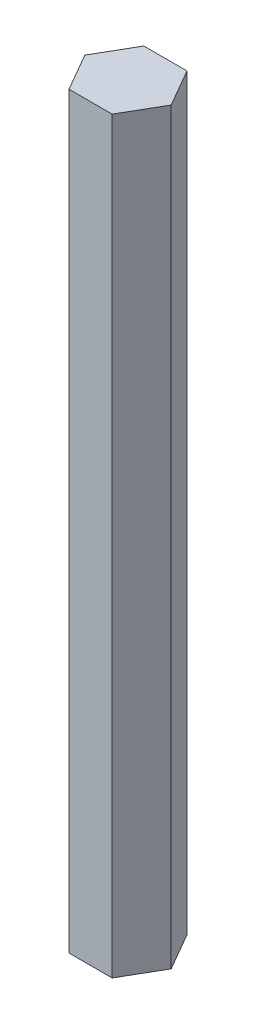
ISO-10303-21;
HEADER;
FILE_DESCRIPTION(('STEP AP214'),'2;1');
FILE_NAME('part.step','',(''),(''),'','','');
FILE_SCHEMA(('AUTOMOTIVE_DESIGN { 1 0 10303 214 1 1 1 1 }'));
ENDSEC;
DATA;
#1=APPLICATION_CONTEXT('core data for automotive mechanical design processes');
#2=APPLICATION_PROTOCOL_DEFINITION('international standard','automotive_design',2000,#1);
#3=PRODUCT_CONTEXT('',#1,'mechanical');
#4=PRODUCT('Part','Part','',(#3));
#5=PRODUCT_RELATED_PRODUCT_CATEGORY('part','',(#4));
#6=PRODUCT_DEFINITION_FORMATION('','',#4);
#7=PRODUCT_DEFINITION_CONTEXT('part definition',#1,'design');
#8=PRODUCT_DEFINITION('design','',#6,#7);
#9=PRODUCT_DEFINITION_SHAPE('','',#8);
#10=(LENGTH_UNIT() NAMED_UNIT(*) SI_UNIT(.MILLI.,.METRE.));
#11=(NAMED_UNIT(*) PLANE_ANGLE_UNIT() SI_UNIT($,.RADIAN.));
#12=(NAMED_UNIT(*) SI_UNIT($,.STERADIAN.) SOLID_ANGLE_UNIT());
#13=UNCERTAINTY_MEASURE_WITH_UNIT(LENGTH_MEASURE(1.E-05),#10,'distance_accuracy_value','');
#14=(GEOMETRIC_REPRESENTATION_CONTEXT(3) GLOBAL_UNCERTAINTY_ASSIGNED_CONTEXT((#13)) GLOBAL_UNIT_ASSIGNED_CONTEXT((#10,
#11,#12)) REPRESENTATION_CONTEXT('',''));
#15=CARTESIAN_POINT('',(0.,0.,0.));
#16=DIRECTION('',(0.,0.,1.));
#17=DIRECTION('',(1.,0.,0.));
#18=AXIS2_PLACEMENT_3D('',#15,#16,#17);
#19=CARTESIAN_POINT('',(1.44337567297406,50.,2.50000000000002));
#20=DIRECTION('',(-0.866025403784439,0.,-0.499999999999999));
#21=DIRECTION('',(-0.499999999999999,0.,0.866025403784439));
#22=AXIS2_PLACEMENT_3D('',#19,#20,#21);
#23=PLANE('',#22);
#24=DIRECTION('',(0.499999999999999,0.,-0.866025403784439));
#25=VECTOR('',#24,1.);
#26=CARTESIAN_POINT('',(1.44337567297406,0.,2.50000000000002));
#27=LINE('',#26,#25);
#28=CARTESIAN_POINT('',(1.44337567297406,0.,2.50000000000002));
#29=VERTEX_POINT('',#28);
#30=CARTESIAN_POINT('',(2.88675134594813,0.,0.));
#31=VERTEX_POINT('',#30);
#32=EDGE_CURVE('E128',#29,#31,#27,.T.);
#33=ORIENTED_EDGE('',*,*,#32,.T.);
#34=DIRECTION('',(0.,-1.,0.));
#35=VECTOR('',#34,1.);
#36=CARTESIAN_POINT('',(2.88675134594813,50.,0.));
#37=LINE('',#36,#35);
#38=CARTESIAN_POINT('',(2.88675134594813,50.,0.));
#39=VERTEX_POINT('',#38);
#40=EDGE_CURVE('E11',#39,#31,#37,.T.);
#41=ORIENTED_EDGE('',*,*,#40,.F.);
#42=DIRECTION('',(0.499999999999999,0.,-0.866025403784439));
#43=VECTOR('',#42,1.);
#44=CARTESIAN_POINT('',(1.44337567297406,50.,2.50000000000002));
#45=LINE('',#44,#43);
#46=CARTESIAN_POINT('',(1.44337567297406,50.,2.50000000000002));
#47=VERTEX_POINT('',#46);
#48=EDGE_CURVE('E144',#47,#39,#45,.T.);
#49=ORIENTED_EDGE('',*,*,#48,.F.);
#50=DIRECTION('',(0.,-1.,0.));
#51=VECTOR('',#50,1.);
#52=CARTESIAN_POINT('',(1.44337567297406,50.,2.50000000000002));
#53=LINE('',#52,#51);
#54=EDGE_CURVE('E124',#47,#29,#53,.T.);
#55=ORIENTED_EDGE('',*,*,#54,.T.);
#56=EDGE_LOOP('',(#33,#41,#49,#55));
#57=FACE_BOUND('',#56,.T.);
#58=ADVANCED_FACE('F39',(#57),#23,.F.);
#59=CARTESIAN_POINT('',(2.88675134594813,50.,0.));
#60=DIRECTION('',(-0.866025403784437,0.,0.500000000000002));
#61=DIRECTION('',(0.500000000000002,0.,0.866025403784438));
#62=AXIS2_PLACEMENT_3D('',#59,#60,#61);
#63=PLANE('',#62);
#64=DIRECTION('',(-0.500000000000002,0.,-0.866025403784437));
#65=VECTOR('',#64,1.);
#66=CARTESIAN_POINT('',(2.88675134594813,0.,0.));
#67=LINE('',#66,#65);
#68=CARTESIAN_POINT('',(1.44337567297403,0.,-2.50000000000004));
#69=VERTEX_POINT('',#68);
#70=EDGE_CURVE('E132',#31,#69,#67,.T.);
#71=ORIENTED_EDGE('',*,*,#70,.T.);
#72=DIRECTION('',(0.,-1.,0.));
#73=VECTOR('',#72,1.);
#74=CARTESIAN_POINT('',(1.44337567297403,50.,-2.50000000000004));
#75=LINE('',#74,#73);
#76=CARTESIAN_POINT('',(1.44337567297403,50.,-2.50000000000004));
#77=VERTEX_POINT('',#76);
#78=EDGE_CURVE('E48',#77,#69,#75,.T.);
#79=ORIENTED_EDGE('',*,*,#78,.F.);
#80=DIRECTION('',(-0.500000000000002,0.,-0.866025403784437));
#81=VECTOR('',#80,1.);
#82=CARTESIAN_POINT('',(2.88675134594813,50.,0.));
#83=LINE('',#82,#81);
#84=EDGE_CURVE('E93',#39,#77,#83,.T.);
#85=ORIENTED_EDGE('',*,*,#84,.F.);
#86=ORIENTED_EDGE('',*,*,#40,.T.);
#87=EDGE_LOOP('',(#71,#79,#85,#86));
#88=FACE_BOUND('',#87,.T.);
#89=ADVANCED_FACE('F172',(#88),#63,.F.);
#90=CARTESIAN_POINT('',(1.44337567297403,50.,-2.50000000000004));
#91=DIRECTION('',(0.,0.,1.));
#92=DIRECTION('',(1.,0.,0.));
#93=AXIS2_PLACEMENT_3D('',#90,#91,#92);
#94=PLANE('',#93);
#95=DIRECTION('',(-1.,0.,0.));
#96=VECTOR('',#95,1.);
#97=CARTESIAN_POINT('',(1.44337567297403,0.,-2.50000000000004));
#98=LINE('',#97,#96);
#99=CARTESIAN_POINT('',(-1.44337567297408,0.,-2.50000000000004));
#100=VERTEX_POINT('',#99);
#101=EDGE_CURVE('E135',#69,#100,#98,.T.);
#102=ORIENTED_EDGE('',*,*,#101,.T.);
#103=DIRECTION('',(0.,-1.,0.));
#104=VECTOR('',#103,1.);
#105=CARTESIAN_POINT('',(-1.44337567297408,50.,-2.50000000000004));
#106=LINE('',#105,#104);
#107=CARTESIAN_POINT('',(-1.44337567297408,50.,-2.50000000000004));
#108=VERTEX_POINT('',#107);
#109=EDGE_CURVE('E117',#108,#100,#106,.T.);
#110=ORIENTED_EDGE('',*,*,#109,.F.);
#111=DIRECTION('',(-1.,0.,0.));
#112=VECTOR('',#111,1.);
#113=CARTESIAN_POINT('',(1.44337567297403,50.,-2.50000000000004));
#114=LINE('',#113,#112);
#115=EDGE_CURVE('E106',#77,#108,#114,.T.);
#116=ORIENTED_EDGE('',*,*,#115,.F.);
#117=ORIENTED_EDGE('',*,*,#78,.T.);
#118=EDGE_LOOP('',(#102,#110,#116,#117));
#119=FACE_BOUND('',#118,.T.);
#120=ADVANCED_FACE('F154',(#119),#94,.F.);
#121=CARTESIAN_POINT('',(-1.44337567297408,50.,-2.50000000000004));
#122=DIRECTION('',(0.86602540378444,0.,0.499999999999997));
#123=DIRECTION('',(0.499999999999997,0.,-0.86602540378444));
#124=AXIS2_PLACEMENT_3D('',#121,#122,#123);
#125=PLANE('',#124);
#126=DIRECTION('',(-0.499999999999997,0.,0.86602540378444));
#127=VECTOR('',#126,1.);
#128=CARTESIAN_POINT('',(-1.44337567297408,0.,-2.50000000000004));
#129=LINE('',#128,#127);
#130=CARTESIAN_POINT('',(-2.88675134594816,0.,0.));
#131=VERTEX_POINT('',#130);
#132=EDGE_CURVE('E115',#100,#131,#129,.T.);
#133=ORIENTED_EDGE('',*,*,#132,.T.);
#134=DIRECTION('',(0.,-1.,0.));
#135=VECTOR('',#134,1.);
#136=CARTESIAN_POINT('',(-2.88675134594816,50.,0.));
#137=LINE('',#136,#135);
#138=CARTESIAN_POINT('',(-2.88675134594816,50.,0.));
#139=VERTEX_POINT('',#138);
#140=EDGE_CURVE('E112',#139,#131,#137,.T.);
#141=ORIENTED_EDGE('',*,*,#140,.F.);
#142=DIRECTION('',(-0.499999999999997,0.,0.86602540378444));
#143=VECTOR('',#142,1.);
#144=CARTESIAN_POINT('',(-1.44337567297408,50.,-2.50000000000004));
#145=LINE('',#144,#143);
#146=EDGE_CURVE('E100',#108,#139,#145,.T.);
#147=ORIENTED_EDGE('',*,*,#146,.F.);
#148=ORIENTED_EDGE('',*,*,#109,.T.);
#149=EDGE_LOOP('',(#133,#141,#147,#148));
#150=FACE_BOUND('',#149,.T.);
#151=ADVANCED_FACE('F113',(#150),#125,.F.);
#152=CARTESIAN_POINT('',(-2.88675134594816,50.,0.));
#153=DIRECTION('',(0.866025403784439,0.,-0.5));
#154=DIRECTION('',(-0.5,0.,-0.866025403784439));
#155=AXIS2_PLACEMENT_3D('',#152,#153,#154);
#156=PLANE('',#155);
#157=DIRECTION('',(0.5,0.,0.866025403784439));
#158=VECTOR('',#157,1.);
#159=CARTESIAN_POINT('',(-2.88675134594816,0.,0.));
#160=LINE('',#159,#158);
#161=CARTESIAN_POINT('',(-1.44337567297409,0.,2.50000000000002));
#162=VERTEX_POINT('',#161);
#163=EDGE_CURVE('E79',#131,#162,#160,.T.);
#164=ORIENTED_EDGE('',*,*,#163,.T.);
#165=DIRECTION('',(0.,-1.,0.));
#166=VECTOR('',#165,1.);
#167=CARTESIAN_POINT('',(-1.44337567297409,50.,2.50000000000002));
#168=LINE('',#167,#166);
#169=CARTESIAN_POINT('',(-1.44337567297409,50.,2.50000000000002));
#170=VERTEX_POINT('',#169);
#171=EDGE_CURVE('E118',#170,#162,#168,.T.);
#172=ORIENTED_EDGE('',*,*,#171,.F.);
#173=DIRECTION('',(0.5,0.,0.866025403784439));
#174=VECTOR('',#173,1.);
#175=CARTESIAN_POINT('',(-2.88675134594816,50.,0.));
#176=LINE('',#175,#174);
#177=EDGE_CURVE('E104',#139,#170,#176,.T.);
#178=ORIENTED_EDGE('',*,*,#177,.F.);
#179=ORIENTED_EDGE('',*,*,#140,.T.);
#180=EDGE_LOOP('',(#164,#172,#178,#179));
#181=FACE_BOUND('',#180,.T.);
#182=ADVANCED_FACE('F120',(#181),#156,.F.);
#183=CARTESIAN_POINT('',(-1.44337567297409,50.,2.50000000000002));
#184=DIRECTION('',(0.,0.,-1.));
#185=DIRECTION('',(-1.,0.,0.));
#186=AXIS2_PLACEMENT_3D('',#183,#184,#185);
#187=PLANE('',#186);
#188=DIRECTION('',(1.,0.,0.));
#189=VECTOR('',#188,1.);
#190=CARTESIAN_POINT('',(-1.44337567297409,0.,2.50000000000002));
#191=LINE('',#190,#189);
#192=EDGE_CURVE('E85',#162,#29,#191,.T.);
#193=ORIENTED_EDGE('',*,*,#192,.T.);
#194=ORIENTED_EDGE('',*,*,#54,.F.);
#195=DIRECTION('',(1.,0.,0.));
#196=VECTOR('',#195,1.);
#197=CARTESIAN_POINT('',(-1.44337567297409,50.,2.50000000000002));
#198=LINE('',#197,#196);
#199=EDGE_CURVE('E56',#170,#47,#198,.T.);
#200=ORIENTED_EDGE('',*,*,#199,.F.);
#201=ORIENTED_EDGE('',*,*,#171,.T.);
#202=EDGE_LOOP('',(#193,#194,#200,#201));
#203=FACE_BOUND('',#202,.T.);
#204=ADVANCED_FACE('F161',(#203),#187,.F.);
#205=CARTESIAN_POINT('',(0.,50.,0.));
#206=DIRECTION('',(0.,1.,0.));
#207=DIRECTION('',(0.,0.,1.));
#208=AXIS2_PLACEMENT_3D('',#205,#206,#207);
#209=PLANE('',#208);
#210=ORIENTED_EDGE('',*,*,#48,.T.);
#211=ORIENTED_EDGE('',*,*,#84,.T.);
#212=ORIENTED_EDGE('',*,*,#115,.T.);
#213=ORIENTED_EDGE('',*,*,#146,.T.);
#214=ORIENTED_EDGE('',*,*,#177,.T.);
#215=ORIENTED_EDGE('',*,*,#199,.T.);
#216=EDGE_LOOP('',(#210,#211,#212,#213,#214,#215));
#217=FACE_BOUND('',#216,.T.);
#218=ADVANCED_FACE('F102',(#217),#209,.T.);
#219=CARTESIAN_POINT('',(0.,0.,0.));
#220=DIRECTION('',(0.,1.,0.));
#221=DIRECTION('',(0.,0.,1.));
#222=AXIS2_PLACEMENT_3D('',#219,#220,#221);
#223=PLANE('',#222);
#224=ORIENTED_EDGE('',*,*,#32,.F.);
#225=ORIENTED_EDGE('',*,*,#192,.F.);
#226=ORIENTED_EDGE('',*,*,#163,.F.);
#227=ORIENTED_EDGE('',*,*,#132,.F.);
#228=ORIENTED_EDGE('',*,*,#101,.F.);
#229=ORIENTED_EDGE('',*,*,#70,.F.);
#230=EDGE_LOOP('',(#224,#225,#226,#227,#228,#229));
#231=FACE_BOUND('',#230,.T.);
#232=ADVANCED_FACE('F157',(#231),#223,.F.);
#233=CLOSED_SHELL('',(#58,#89,#120,#151,#182,#204,#218,#232));
#234=MANIFOLD_SOLID_BREP('B2',#233);
#235=ADVANCED_BREP_SHAPE_REPRESENTATION('',(#18,#234),#14);
#236=SHAPE_DEFINITION_REPRESENTATION(#9,#235);
ENDSEC;
END-ISO-10303-21;
